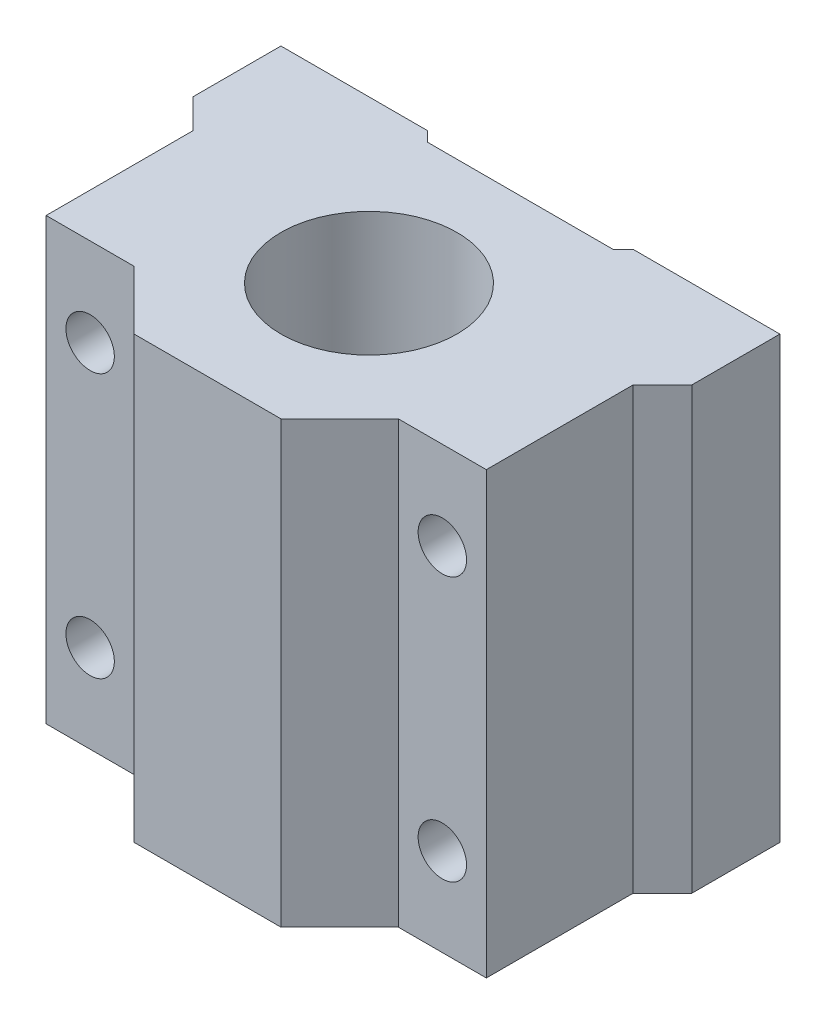
ISO-10303-21;
HEADER;
FILE_DESCRIPTION(('STEP AP214'),'2;1');
FILE_NAME('part.step','',(''),(''),'','','');
FILE_SCHEMA(('AUTOMOTIVE_DESIGN { 1 0 10303 214 1 1 1 1 }'));
ENDSEC;
DATA;
#1=APPLICATION_CONTEXT('core data for automotive mechanical design processes');
#2=APPLICATION_PROTOCOL_DEFINITION('international standard','automotive_design',2000,#1);
#3=PRODUCT_CONTEXT('',#1,'mechanical');
#4=PRODUCT('Part','Part','',(#3));
#5=PRODUCT_RELATED_PRODUCT_CATEGORY('part','',(#4));
#6=PRODUCT_DEFINITION_FORMATION('','',#4);
#7=PRODUCT_DEFINITION_CONTEXT('part definition',#1,'design');
#8=PRODUCT_DEFINITION('design','',#6,#7);
#9=PRODUCT_DEFINITION_SHAPE('','',#8);
#10=(LENGTH_UNIT() NAMED_UNIT(*) SI_UNIT(.MILLI.,.METRE.));
#11=(NAMED_UNIT(*) PLANE_ANGLE_UNIT() SI_UNIT($,.RADIAN.));
#12=(NAMED_UNIT(*) SI_UNIT($,.STERADIAN.) SOLID_ANGLE_UNIT());
#13=UNCERTAINTY_MEASURE_WITH_UNIT(LENGTH_MEASURE(1.E-05),#10,'distance_accuracy_value','');
#14=(GEOMETRIC_REPRESENTATION_CONTEXT(3) GLOBAL_UNCERTAINTY_ASSIGNED_CONTEXT((#13)) GLOBAL_UNIT_ASSIGNED_CONTEXT((#10,
#11,#12)) REPRESENTATION_CONTEXT('',''));
#15=CARTESIAN_POINT('',(0.,0.,0.));
#16=DIRECTION('',(0.,0.,1.));
#17=DIRECTION('',(1.,0.,0.));
#18=AXIS2_PLACEMENT_3D('',#15,#16,#17);
#19=CARTESIAN_POINT('',(0.,30.,-11.));
#20=DIRECTION('',(0.,0.,1.));
#21=DIRECTION('',(1.,0.,0.));
#22=AXIS2_PLACEMENT_3D('',#19,#20,#21);
#23=PLANE('',#22);
#24=CARTESIAN_POINT('',(-12.,6.,-11.));
#25=DIRECTION('',(0.,0.,-1.));
#26=DIRECTION('',(-1.,0.,0.));
#27=AXIS2_PLACEMENT_3D('',#24,#25,#26);
#28=CIRCLE('',#27,1.65);
#29=CARTESIAN_POINT('',(-13.65,6.,-11.));
#30=VERTEX_POINT('',#29);
#31=EDGE_CURVE('E232',#30,#30,#28,.T.);
#32=ORIENTED_EDGE('',*,*,#31,.F.);
#33=EDGE_LOOP('',(#32));
#34=FACE_BOUND('',#33,.T.);
#35=CARTESIAN_POINT('',(-12.,24.,-11.));
#36=DIRECTION('',(0.,0.,-1.));
#37=DIRECTION('',(1.,0.,0.));
#38=AXIS2_PLACEMENT_3D('',#35,#36,#37);
#39=CIRCLE('',#38,1.65);
#40=CARTESIAN_POINT('',(-10.35,24.,-11.));
#41=VERTEX_POINT('',#40);
#42=EDGE_CURVE('E321',#41,#41,#39,.T.);
#43=ORIENTED_EDGE('',*,*,#42,.F.);
#44=EDGE_LOOP('',(#43));
#45=FACE_BOUND('',#44,.T.);
#46=DIRECTION('',(-1.,0.,0.));
#47=VECTOR('',#46,1.);
#48=CARTESIAN_POINT('',(0.,30.,-11.));
#49=LINE('',#48,#47);
#50=CARTESIAN_POINT('',(-7.,30.,-11.));
#51=VERTEX_POINT('',#50);
#52=CARTESIAN_POINT('',(-17.,30.,-11.));
#53=VERTEX_POINT('',#52);
#54=EDGE_CURVE('E330',#51,#53,#49,.T.);
#55=ORIENTED_EDGE('',*,*,#54,.F.);
#56=DIRECTION('',(0.,-1.,0.));
#57=VECTOR('',#56,1.);
#58=CARTESIAN_POINT('',(-7.,30.,-11.));
#59=LINE('',#58,#57);
#60=CARTESIAN_POINT('',(-7.,0.,-11.));
#61=VERTEX_POINT('',#60);
#62=EDGE_CURVE('E316',#51,#61,#59,.T.);
#63=ORIENTED_EDGE('',*,*,#62,.T.);
#64=DIRECTION('',(-1.,0.,0.));
#65=VECTOR('',#64,1.);
#66=CARTESIAN_POINT('',(0.,0.,-11.));
#67=LINE('',#66,#65);
#68=CARTESIAN_POINT('',(-17.,0.,-11.));
#69=VERTEX_POINT('',#68);
#70=EDGE_CURVE('E174',#61,#69,#67,.T.);
#71=ORIENTED_EDGE('',*,*,#70,.T.);
#72=DIRECTION('',(0.,-1.,0.));
#73=VECTOR('',#72,1.);
#74=CARTESIAN_POINT('',(-17.,30.,-11.));
#75=LINE('',#74,#73);
#76=EDGE_CURVE('E44',#53,#69,#75,.T.);
#77=ORIENTED_EDGE('',*,*,#76,.F.);
#78=EDGE_LOOP('',(#55,#63,#71,#77));
#79=FACE_BOUND('',#78,.T.);
#80=ADVANCED_FACE('F35',(#34,#45,#79),#23,.F.);
#81=CARTESIAN_POINT('',(17.,30.,0.));
#82=DIRECTION('',(1.,0.,0.));
#83=DIRECTION('',(0.,0.,-1.));
#84=AXIS2_PLACEMENT_3D('',#81,#82,#83);
#85=PLANE('',#84);
#86=DIRECTION('',(0.,0.,1.));
#87=VECTOR('',#86,1.);
#88=CARTESIAN_POINT('',(17.,0.,0.));
#89=LINE('',#88,#87);
#90=CARTESIAN_POINT('',(17.,0.,-11.));
#91=VERTEX_POINT('',#90);
#92=CARTESIAN_POINT('',(17.,0.,-4.99999999999999));
#93=VERTEX_POINT('',#92);
#94=EDGE_CURVE('E172',#91,#93,#89,.T.);
#95=ORIENTED_EDGE('',*,*,#94,.F.);
#96=DIRECTION('',(0.,-1.,0.));
#97=VECTOR('',#96,1.);
#98=CARTESIAN_POINT('',(17.,30.,-11.));
#99=LINE('',#98,#97);
#100=CARTESIAN_POINT('',(17.,30.,-11.));
#101=VERTEX_POINT('',#100);
#102=EDGE_CURVE('E11',#101,#91,#99,.T.);
#103=ORIENTED_EDGE('',*,*,#102,.F.);
#104=DIRECTION('',(0.,0.,1.));
#105=VECTOR('',#104,1.);
#106=CARTESIAN_POINT('',(17.,30.,0.));
#107=LINE('',#106,#105);
#108=CARTESIAN_POINT('',(17.,30.,-4.99999999999999));
#109=VERTEX_POINT('',#108);
#110=EDGE_CURVE('E328',#101,#109,#107,.T.);
#111=ORIENTED_EDGE('',*,*,#110,.T.);
#112=DIRECTION('',(0.,-1.,0.));
#113=VECTOR('',#112,1.);
#114=CARTESIAN_POINT('',(17.,30.,-4.99999999999999));
#115=LINE('',#114,#113);
#116=EDGE_CURVE('E61',#109,#93,#115,.T.);
#117=ORIENTED_EDGE('',*,*,#116,.T.);
#118=EDGE_LOOP('',(#95,#103,#111,#117));
#119=FACE_BOUND('',#118,.T.);
#120=ADVANCED_FACE('F262',(#119),#85,.T.);
#121=CARTESIAN_POINT('',(12.,6.,-11.));
#122=DIRECTION('',(0.,0.,-1.));
#123=DIRECTION('',(1.,0.,0.));
#124=AXIS2_PLACEMENT_3D('',#121,#122,#123);
#125=CIRCLE('',#124,1.65);
#126=CARTESIAN_POINT('',(13.65,6.,-11.));
#127=VERTEX_POINT('',#126);
#128=EDGE_CURVE('E283',#127,#127,#125,.T.);
#129=ORIENTED_EDGE('',*,*,#128,.F.);
#130=EDGE_LOOP('',(#129));
#131=FACE_BOUND('',#130,.T.);
#132=CARTESIAN_POINT('',(12.,24.,-11.));
#133=DIRECTION('',(0.,0.,-1.));
#134=DIRECTION('',(-1.,0.,0.));
#135=AXIS2_PLACEMENT_3D('',#132,#133,#134);
#136=CIRCLE('',#135,1.65);
#137=CARTESIAN_POINT('',(10.35,24.,-11.));
#138=VERTEX_POINT('',#137);
#139=EDGE_CURVE('E287',#138,#138,#136,.T.);
#140=ORIENTED_EDGE('',*,*,#139,.F.);
#141=EDGE_LOOP('',(#140));
#142=FACE_BOUND('',#141,.T.);
#143=CARTESIAN_POINT('',(7.,0.,-11.));
#144=VERTEX_POINT('',#143);
#145=EDGE_CURVE('E175',#91,#144,#67,.T.);
#146=ORIENTED_EDGE('',*,*,#145,.T.);
#147=DIRECTION('',(0.,-1.,0.));
#148=VECTOR('',#147,1.);
#149=CARTESIAN_POINT('',(7.,30.,-11.));
#150=LINE('',#149,#148);
#151=CARTESIAN_POINT('',(7.,30.,-11.));
#152=VERTEX_POINT('',#151);
#153=EDGE_CURVE('E52',#152,#144,#150,.T.);
#154=ORIENTED_EDGE('',*,*,#153,.F.);
#155=EDGE_CURVE('E331',#101,#152,#49,.T.);
#156=ORIENTED_EDGE('',*,*,#155,.F.);
#157=ORIENTED_EDGE('',*,*,#102,.T.);
#158=EDGE_LOOP('',(#146,#154,#156,#157));
#159=FACE_BOUND('',#158,.T.);
#160=ADVANCED_FACE('F265',(#131,#142,#159),#23,.F.);
#161=CARTESIAN_POINT('',(-17.,30.,0.));
#162=DIRECTION('',(1.,0.,0.));
#163=DIRECTION('',(0.,0.,-1.));
#164=AXIS2_PLACEMENT_3D('',#161,#162,#163);
#165=PLANE('',#164);
#166=DIRECTION('',(0.,0.,1.));
#167=VECTOR('',#166,1.);
#168=CARTESIAN_POINT('',(-17.,0.,0.));
#169=LINE('',#168,#167);
#170=CARTESIAN_POINT('',(-17.,0.,-4.99999999999999));
#171=VERTEX_POINT('',#170);
#172=EDGE_CURVE('E178',#69,#171,#169,.T.);
#173=ORIENTED_EDGE('',*,*,#172,.T.);
#174=DIRECTION('',(0.,-1.,0.));
#175=VECTOR('',#174,1.);
#176=CARTESIAN_POINT('',(-17.,30.,-4.99999999999999));
#177=LINE('',#176,#175);
#178=CARTESIAN_POINT('',(-17.,30.,-4.99999999999999));
#179=VERTEX_POINT('',#178);
#180=EDGE_CURVE('E223',#179,#171,#177,.T.);
#181=ORIENTED_EDGE('',*,*,#180,.F.);
#182=DIRECTION('',(0.,0.,1.));
#183=VECTOR('',#182,1.);
#184=CARTESIAN_POINT('',(-17.,30.,0.));
#185=LINE('',#184,#183);
#186=EDGE_CURVE('E333',#53,#179,#185,.T.);
#187=ORIENTED_EDGE('',*,*,#186,.F.);
#188=ORIENTED_EDGE('',*,*,#76,.T.);
#189=EDGE_LOOP('',(#173,#181,#187,#188));
#190=FACE_BOUND('',#189,.T.);
#191=ADVANCED_FACE('F273',(#190),#165,.F.);
#192=CARTESIAN_POINT('',(-6.00000000000006,30.,6.00000000000001));
#193=DIRECTION('',(0.707106781186551,0.,-0.707106781186544));
#194=DIRECTION('',(-0.707106781186544,0.,-0.707106781186551));
#195=AXIS2_PLACEMENT_3D('',#192,#193,#194);
#196=PLANE('',#195);
#197=DIRECTION('',(0.707106781186544,0.,0.707106781186551));
#198=VECTOR('',#197,1.);
#199=CARTESIAN_POINT('',(-6.00000000000006,0.,6.00000000000001));
#200=LINE('',#199,#198);
#201=CARTESIAN_POINT('',(-14.9988878092421,0.,-2.99888780924207));
#202=VERTEX_POINT('',#201);
#203=EDGE_CURVE('E181',#171,#202,#200,.T.);
#204=ORIENTED_EDGE('',*,*,#203,.T.);
#205=DIRECTION('',(0.,-1.,0.));
#206=VECTOR('',#205,1.);
#207=CARTESIAN_POINT('',(-14.9988878092421,30.,-2.99888780924207));
#208=LINE('',#207,#206);
#209=CARTESIAN_POINT('',(-14.9988878092421,30.,-2.99888780924207));
#210=VERTEX_POINT('',#209);
#211=EDGE_CURVE('E220',#210,#202,#208,.T.);
#212=ORIENTED_EDGE('',*,*,#211,.F.);
#213=DIRECTION('',(0.707106781186544,0.,0.707106781186551));
#214=VECTOR('',#213,1.);
#215=CARTESIAN_POINT('',(-6.00000000000006,30.,6.00000000000001));
#216=LINE('',#215,#214);
#217=EDGE_CURVE('E336',#179,#210,#216,.T.);
#218=ORIENTED_EDGE('',*,*,#217,.F.);
#219=ORIENTED_EDGE('',*,*,#180,.T.);
#220=EDGE_LOOP('',(#204,#212,#218,#219));
#221=FACE_BOUND('',#220,.T.);
#222=ADVANCED_FACE('F278',(#221),#196,.F.);
#223=CARTESIAN_POINT('',(-14.9988878092421,30.,0.));
#224=DIRECTION('',(1.,0.,0.));
#225=DIRECTION('',(0.,0.,-1.));
#226=AXIS2_PLACEMENT_3D('',#223,#224,#225);
#227=PLANE('',#226);
#228=DIRECTION('',(0.,0.,1.));
#229=VECTOR('',#228,1.);
#230=CARTESIAN_POINT('',(-14.9988878092421,0.,0.));
#231=LINE('',#230,#229);
#232=CARTESIAN_POINT('',(-14.9988878092421,0.,7.00111219075793));
#233=VERTEX_POINT('',#232);
#234=EDGE_CURVE('E184',#202,#233,#231,.T.);
#235=ORIENTED_EDGE('',*,*,#234,.T.);
#236=DIRECTION('',(0.,-1.,0.));
#237=VECTOR('',#236,1.);
#238=CARTESIAN_POINT('',(-14.9988878092421,30.,7.00111219075793));
#239=LINE('',#238,#237);
#240=CARTESIAN_POINT('',(-14.9988878092421,30.,7.00111219075793));
#241=VERTEX_POINT('',#240);
#242=EDGE_CURVE('E217',#241,#233,#239,.T.);
#243=ORIENTED_EDGE('',*,*,#242,.F.);
#244=DIRECTION('',(0.,0.,1.));
#245=VECTOR('',#244,1.);
#246=CARTESIAN_POINT('',(-14.9988878092421,30.,0.));
#247=LINE('',#246,#245);
#248=EDGE_CURVE('E339',#210,#241,#247,.T.);
#249=ORIENTED_EDGE('',*,*,#248,.F.);
#250=ORIENTED_EDGE('',*,*,#211,.T.);
#251=EDGE_LOOP('',(#235,#243,#249,#250));
#252=FACE_BOUND('',#251,.T.);
#253=ADVANCED_FACE('F384',(#252),#227,.F.);
#254=CARTESIAN_POINT('',(0.,30.,7.00111219075794));
#255=DIRECTION('',(0.,0.,-1.));
#256=DIRECTION('',(-1.,0.,0.));
#257=AXIS2_PLACEMENT_3D('',#254,#255,#256);
#258=PLANE('',#257);
#259=CARTESIAN_POINT('',(-12.,24.,7.00111219075793));
#260=DIRECTION('',(0.,0.,-1.));
#261=DIRECTION('',(-1.,0.,0.));
#262=AXIS2_PLACEMENT_3D('',#259,#260,#261);
#263=CIRCLE('',#262,1.65);
#264=CARTESIAN_POINT('',(-13.65,24.,7.00111219075793));
#265=VERTEX_POINT('',#264);
#266=EDGE_CURVE('E39',#265,#265,#263,.T.);
#267=ORIENTED_EDGE('',*,*,#266,.T.);
#268=EDGE_LOOP('',(#267));
#269=FACE_BOUND('',#268,.T.);
#270=CARTESIAN_POINT('',(-12.,6.,7.00111219075793));
#271=DIRECTION('',(0.,0.,-1.));
#272=DIRECTION('',(-1.,0.,0.));
#273=AXIS2_PLACEMENT_3D('',#270,#271,#272);
#274=CIRCLE('',#273,1.65);
#275=CARTESIAN_POINT('',(-13.65,6.,7.00111219075793));
#276=VERTEX_POINT('',#275);
#277=EDGE_CURVE('E234',#276,#276,#274,.T.);
#278=ORIENTED_EDGE('',*,*,#277,.T.);
#279=EDGE_LOOP('',(#278));
#280=FACE_BOUND('',#279,.T.);
#281=DIRECTION('',(1.,0.,0.));
#282=VECTOR('',#281,1.);
#283=CARTESIAN_POINT('',(0.,0.,7.00111219075794));
#284=LINE('',#283,#282);
#285=CARTESIAN_POINT('',(-8.99888780924206,0.,7.00111219075793));
#286=VERTEX_POINT('',#285);
#287=EDGE_CURVE('E187',#233,#286,#284,.T.);
#288=ORIENTED_EDGE('',*,*,#287,.T.);
#289=DIRECTION('',(0.,-1.,0.));
#290=VECTOR('',#289,1.);
#291=CARTESIAN_POINT('',(-8.99888780924206,30.,7.00111219075793));
#292=LINE('',#291,#290);
#293=CARTESIAN_POINT('',(-8.99888780924206,30.,7.00111219075793));
#294=VERTEX_POINT('',#293);
#295=EDGE_CURVE('E214',#294,#286,#292,.T.);
#296=ORIENTED_EDGE('',*,*,#295,.F.);
#297=DIRECTION('',(1.,0.,0.));
#298=VECTOR('',#297,1.);
#299=CARTESIAN_POINT('',(0.,30.,7.00111219075794));
#300=LINE('',#299,#298);
#301=EDGE_CURVE('E342',#241,#294,#300,.T.);
#302=ORIENTED_EDGE('',*,*,#301,.F.);
#303=ORIENTED_EDGE('',*,*,#242,.T.);
#304=EDGE_LOOP('',(#288,#296,#302,#303));
#305=FACE_BOUND('',#304,.T.);
#306=ADVANCED_FACE('F241',(#269,#280,#305),#258,.F.);
#307=CARTESIAN_POINT('',(-7.99999999999999,30.,8.00000000000001));
#308=DIRECTION('',(0.707106781186547,0.,-0.707106781186549));
#309=DIRECTION('',(-0.707106781186549,0.,-0.707106781186547));
#310=AXIS2_PLACEMENT_3D('',#307,#308,#309);
#311=PLANE('',#310);
#312=DIRECTION('',(0.707106781186548,0.,0.707106781186547));
#313=VECTOR('',#312,1.);
#314=CARTESIAN_POINT('',(-7.99999999999999,0.,8.00000000000001));
#315=LINE('',#314,#313);
#316=CARTESIAN_POINT('',(-4.99999999999999,0.,11.));
#317=VERTEX_POINT('',#316);
#318=EDGE_CURVE('E190',#286,#317,#315,.T.);
#319=ORIENTED_EDGE('',*,*,#318,.T.);
#320=DIRECTION('',(0.,-1.,0.));
#321=VECTOR('',#320,1.);
#322=CARTESIAN_POINT('',(-4.99999999999999,30.,11.));
#323=LINE('',#322,#321);
#324=CARTESIAN_POINT('',(-4.99999999999999,30.,11.));
#325=VERTEX_POINT('',#324);
#326=EDGE_CURVE('E211',#325,#317,#323,.T.);
#327=ORIENTED_EDGE('',*,*,#326,.F.);
#328=DIRECTION('',(0.707106781186548,0.,0.707106781186547));
#329=VECTOR('',#328,1.);
#330=CARTESIAN_POINT('',(-7.99999999999999,30.,8.00000000000001));
#331=LINE('',#330,#329);
#332=EDGE_CURVE('E345',#294,#325,#331,.T.);
#333=ORIENTED_EDGE('',*,*,#332,.F.);
#334=ORIENTED_EDGE('',*,*,#295,.T.);
#335=EDGE_LOOP('',(#319,#327,#333,#334));
#336=FACE_BOUND('',#335,.T.);
#337=ADVANCED_FACE('F387',(#336),#311,.F.);
#338=CARTESIAN_POINT('',(0.,30.,11.));
#339=DIRECTION('',(0.,0.,-1.));
#340=DIRECTION('',(-1.,0.,0.));
#341=AXIS2_PLACEMENT_3D('',#338,#339,#340);
#342=PLANE('',#341);
#343=DIRECTION('',(1.,0.,0.));
#344=VECTOR('',#343,1.);
#345=CARTESIAN_POINT('',(0.,0.,11.));
#346=LINE('',#345,#344);
#347=CARTESIAN_POINT('',(4.99999999999999,0.,11.));
#348=VERTEX_POINT('',#347);
#349=EDGE_CURVE('E193',#317,#348,#346,.T.);
#350=ORIENTED_EDGE('',*,*,#349,.T.);
#351=DIRECTION('',(0.,-1.,0.));
#352=VECTOR('',#351,1.);
#353=CARTESIAN_POINT('',(4.99999999999999,30.,11.));
#354=LINE('',#353,#352);
#355=CARTESIAN_POINT('',(4.99999999999999,30.,11.));
#356=VERTEX_POINT('',#355);
#357=EDGE_CURVE('E209',#356,#348,#354,.T.);
#358=ORIENTED_EDGE('',*,*,#357,.F.);
#359=DIRECTION('',(1.,0.,0.));
#360=VECTOR('',#359,1.);
#361=CARTESIAN_POINT('',(0.,30.,11.));
#362=LINE('',#361,#360);
#363=EDGE_CURVE('E348',#325,#356,#362,.T.);
#364=ORIENTED_EDGE('',*,*,#363,.F.);
#365=ORIENTED_EDGE('',*,*,#326,.T.);
#366=EDGE_LOOP('',(#350,#358,#364,#365));
#367=FACE_BOUND('',#366,.T.);
#368=ADVANCED_FACE('F390',(#367),#342,.F.);
#369=CARTESIAN_POINT('',(7.99999999999999,30.,8.00000000000001));
#370=DIRECTION('',(0.707106781186547,0.,0.707106781186549));
#371=DIRECTION('',(0.707106781186549,0.,-0.707106781186547));
#372=AXIS2_PLACEMENT_3D('',#369,#370,#371);
#373=PLANE('',#372);
#374=DIRECTION('',(-0.707106781186548,0.,0.707106781186547));
#375=VECTOR('',#374,1.);
#376=CARTESIAN_POINT('',(7.99999999999999,0.,8.00000000000001));
#377=LINE('',#376,#375);
#378=CARTESIAN_POINT('',(8.99888780924207,0.,7.00111219075793));
#379=VERTEX_POINT('',#378);
#380=EDGE_CURVE('E196',#379,#348,#377,.T.);
#381=ORIENTED_EDGE('',*,*,#380,.F.);
#382=DIRECTION('',(0.,-1.,0.));
#383=VECTOR('',#382,1.);
#384=CARTESIAN_POINT('',(8.99888780924207,30.,7.00111219075793));
#385=LINE('',#384,#383);
#386=CARTESIAN_POINT('',(8.99888780924207,30.,7.00111219075793));
#387=VERTEX_POINT('',#386);
#388=EDGE_CURVE('E149',#387,#379,#385,.T.);
#389=ORIENTED_EDGE('',*,*,#388,.F.);
#390=DIRECTION('',(-0.707106781186548,0.,0.707106781186547));
#391=VECTOR('',#390,1.);
#392=CARTESIAN_POINT('',(7.99999999999999,30.,8.00000000000001));
#393=LINE('',#392,#391);
#394=EDGE_CURVE('E161',#387,#356,#393,.T.);
#395=ORIENTED_EDGE('',*,*,#394,.T.);
#396=ORIENTED_EDGE('',*,*,#357,.T.);
#397=EDGE_LOOP('',(#381,#389,#395,#396));
#398=FACE_BOUND('',#397,.T.);
#399=ADVANCED_FACE('F351',(#398),#373,.T.);
#400=CARTESIAN_POINT('',(0.,30.,7.00111219075794));
#401=DIRECTION('',(0.,0.,1.));
#402=DIRECTION('',(1.,0.,0.));
#403=AXIS2_PLACEMENT_3D('',#400,#401,#402);
#404=PLANE('',#403);
#405=CARTESIAN_POINT('',(12.,6.,7.00111219075793));
#406=DIRECTION('',(0.,0.,1.));
#407=DIRECTION('',(1.,0.,0.));
#408=AXIS2_PLACEMENT_3D('',#405,#406,#407);
#409=CIRCLE('',#408,1.65);
#410=CARTESIAN_POINT('',(13.65,6.,7.00111219075793));
#411=VERTEX_POINT('',#410);
#412=EDGE_CURVE('E231',#411,#411,#409,.T.);
#413=ORIENTED_EDGE('',*,*,#412,.F.);
#414=EDGE_LOOP('',(#413));
#415=FACE_BOUND('',#414,.T.);
#416=CARTESIAN_POINT('',(12.,24.,7.00111219075793));
#417=DIRECTION('',(0.,0.,1.));
#418=DIRECTION('',(1.,0.,0.));
#419=AXIS2_PLACEMENT_3D('',#416,#417,#418);
#420=CIRCLE('',#419,1.65);
#421=CARTESIAN_POINT('',(13.65,24.,7.00111219075793));
#422=VERTEX_POINT('',#421);
#423=EDGE_CURVE('E228',#422,#422,#420,.T.);
#424=ORIENTED_EDGE('',*,*,#423,.F.);
#425=EDGE_LOOP('',(#424));
#426=FACE_BOUND('',#425,.T.);
#427=DIRECTION('',(-1.,0.,0.));
#428=VECTOR('',#427,1.);
#429=CARTESIAN_POINT('',(0.,0.,7.00111219075794));
#430=LINE('',#429,#428);
#431=CARTESIAN_POINT('',(14.9988878092421,0.,7.00111219075793));
#432=VERTEX_POINT('',#431);
#433=EDGE_CURVE('E144',#432,#379,#430,.T.);
#434=ORIENTED_EDGE('',*,*,#433,.F.);
#435=DIRECTION('',(0.,-1.,0.));
#436=VECTOR('',#435,1.);
#437=CARTESIAN_POINT('',(14.9988878092421,30.,7.00111219075793));
#438=LINE('',#437,#436);
#439=CARTESIAN_POINT('',(14.9988878092421,30.,7.00111219075793));
#440=VERTEX_POINT('',#439);
#441=EDGE_CURVE('E139',#440,#432,#438,.T.);
#442=ORIENTED_EDGE('',*,*,#441,.F.);
#443=DIRECTION('',(-1.,0.,0.));
#444=VECTOR('',#443,1.);
#445=CARTESIAN_POINT('',(0.,30.,7.00111219075794));
#446=LINE('',#445,#444);
#447=EDGE_CURVE('E142',#440,#387,#446,.T.);
#448=ORIENTED_EDGE('',*,*,#447,.T.);
#449=ORIENTED_EDGE('',*,*,#388,.T.);
#450=EDGE_LOOP('',(#434,#442,#448,#449));
#451=FACE_BOUND('',#450,.T.);
#452=ADVANCED_FACE('F141',(#415,#426,#451),#404,.T.);
#453=CARTESIAN_POINT('',(14.9988878092421,30.,0.));
#454=DIRECTION('',(1.,0.,0.));
#455=DIRECTION('',(0.,0.,-1.));
#456=AXIS2_PLACEMENT_3D('',#453,#454,#455);
#457=PLANE('',#456);
#458=DIRECTION('',(0.,0.,1.));
#459=VECTOR('',#458,1.);
#460=CARTESIAN_POINT('',(14.9988878092421,0.,0.));
#461=LINE('',#460,#459);
#462=CARTESIAN_POINT('',(14.9988878092421,0.,-2.99888780924207));
#463=VERTEX_POINT('',#462);
#464=EDGE_CURVE('E200',#463,#432,#461,.T.);
#465=ORIENTED_EDGE('',*,*,#464,.F.);
#466=DIRECTION('',(0.,-1.,0.));
#467=VECTOR('',#466,1.);
#468=CARTESIAN_POINT('',(14.9988878092421,30.,-2.99888780924207));
#469=LINE('',#468,#467);
#470=CARTESIAN_POINT('',(14.9988878092421,30.,-2.99888780924207));
#471=VERTEX_POINT('',#470);
#472=EDGE_CURVE('E150',#471,#463,#469,.T.);
#473=ORIENTED_EDGE('',*,*,#472,.F.);
#474=DIRECTION('',(0.,0.,1.));
#475=VECTOR('',#474,1.);
#476=CARTESIAN_POINT('',(14.9988878092421,30.,0.));
#477=LINE('',#476,#475);
#478=EDGE_CURVE('E159',#471,#440,#477,.T.);
#479=ORIENTED_EDGE('',*,*,#478,.T.);
#480=ORIENTED_EDGE('',*,*,#441,.T.);
#481=EDGE_LOOP('',(#465,#473,#479,#480));
#482=FACE_BOUND('',#481,.T.);
#483=ADVANCED_FACE('F163',(#482),#457,.T.);
#484=CARTESIAN_POINT('',(0.,30.,0.));
#485=DIRECTION('',(0.,-1.,0.));
#486=DIRECTION('',(0.,0.,-1.));
#487=AXIS2_PLACEMENT_3D('',#484,#485,#486);
#488=CYLINDRICAL_SURFACE('',#487,6.);
#489=CARTESIAN_POINT('',(0.,30.,0.));
#490=DIRECTION('',(0.,1.,0.));
#491=DIRECTION('',(0.,0.,1.));
#492=AXIS2_PLACEMENT_3D('',#489,#490,#491);
#493=CIRCLE('',#492,6.);
#494=CARTESIAN_POINT('',(0.,30.,6.));
#495=VERTEX_POINT('',#494);
#496=EDGE_CURVE('E205',#495,#495,#493,.T.);
#497=ORIENTED_EDGE('',*,*,#496,.T.);
#498=EDGE_LOOP('',(#497));
#499=FACE_BOUND('',#498,.T.);
#500=CARTESIAN_POINT('',(0.,0.,0.));
#501=DIRECTION('',(0.,1.,0.));
#502=DIRECTION('',(0.,0.,1.));
#503=AXIS2_PLACEMENT_3D('',#500,#501,#502);
#504=CIRCLE('',#503,6.);
#505=CARTESIAN_POINT('',(0.,0.,6.));
#506=VERTEX_POINT('',#505);
#507=EDGE_CURVE('E169',#506,#506,#504,.T.);
#508=ORIENTED_EDGE('',*,*,#507,.F.);
#509=EDGE_LOOP('',(#508));
#510=FACE_BOUND('',#509,.T.);
#511=ADVANCED_FACE('F37',(#499,#510),#488,.F.);
#512=CARTESIAN_POINT('',(6.00000000000005,30.,6.00000000000001));
#513=DIRECTION('',(0.70710678118655,0.,0.707106781186545));
#514=DIRECTION('',(0.707106781186545,0.,-0.70710678118655));
#515=AXIS2_PLACEMENT_3D('',#512,#513,#514);
#516=PLANE('',#515);
#517=DIRECTION('',(-0.707106781186545,0.,0.70710678118655));
#518=VECTOR('',#517,1.);
#519=CARTESIAN_POINT('',(6.00000000000005,0.,6.00000000000001));
#520=LINE('',#519,#518);
#521=EDGE_CURVE('E202',#93,#463,#520,.T.);
#522=ORIENTED_EDGE('',*,*,#521,.F.);
#523=ORIENTED_EDGE('',*,*,#116,.F.);
#524=DIRECTION('',(-0.707106781186545,0.,0.70710678118655));
#525=VECTOR('',#524,1.);
#526=CARTESIAN_POINT('',(6.00000000000005,30.,6.00000000000001));
#527=LINE('',#526,#525);
#528=EDGE_CURVE('E164',#109,#471,#527,.T.);
#529=ORIENTED_EDGE('',*,*,#528,.T.);
#530=ORIENTED_EDGE('',*,*,#472,.T.);
#531=EDGE_LOOP('',(#522,#523,#529,#530));
#532=FACE_BOUND('',#531,.T.);
#533=ADVANCED_FACE('F353',(#532),#516,.T.);
#534=CARTESIAN_POINT('',(0.,30.,0.));
#535=DIRECTION('',(0.,1.,0.));
#536=DIRECTION('',(0.,0.,1.));
#537=AXIS2_PLACEMENT_3D('',#534,#535,#536);
#538=PLANE('',#537);
#539=DIRECTION('',(-0.707106781186546,0.,-0.707106781186549));
#540=VECTOR('',#539,1.);
#541=CARTESIAN_POINT('',(-7.,30.,-11.));
#542=LINE('',#541,#540);
#543=CARTESIAN_POINT('',(-6.315883029906,30.,-10.315883029906));
#544=VERTEX_POINT('',#543);
#545=EDGE_CURVE('E303',#544,#51,#542,.T.);
#546=ORIENTED_EDGE('',*,*,#545,.T.);
#547=ORIENTED_EDGE('',*,*,#54,.T.);
#548=ORIENTED_EDGE('',*,*,#186,.T.);
#549=ORIENTED_EDGE('',*,*,#217,.T.);
#550=ORIENTED_EDGE('',*,*,#248,.T.);
#551=ORIENTED_EDGE('',*,*,#301,.T.);
#552=ORIENTED_EDGE('',*,*,#332,.T.);
#553=ORIENTED_EDGE('',*,*,#363,.T.);
#554=ORIENTED_EDGE('',*,*,#394,.F.);
#555=ORIENTED_EDGE('',*,*,#447,.F.);
#556=ORIENTED_EDGE('',*,*,#478,.F.);
#557=ORIENTED_EDGE('',*,*,#528,.F.);
#558=ORIENTED_EDGE('',*,*,#110,.F.);
#559=ORIENTED_EDGE('',*,*,#155,.T.);
#560=DIRECTION('',(-0.707106781186551,0.,0.707106781186544));
#561=VECTOR('',#560,1.);
#562=CARTESIAN_POINT('',(7.,30.,-11.));
#563=LINE('',#562,#561);
#564=CARTESIAN_POINT('',(6.31588302990599,30.,-10.315883029906));
#565=VERTEX_POINT('',#564);
#566=EDGE_CURVE('E358',#152,#565,#563,.T.);
#567=ORIENTED_EDGE('',*,*,#566,.T.);
#568=DIRECTION('',(-1.,0.,0.));
#569=VECTOR('',#568,1.);
#570=CARTESIAN_POINT('',(-6.315883029906,30.,-10.315883029906));
#571=LINE('',#570,#569);
#572=EDGE_CURVE('E319',#565,#544,#571,.T.);
#573=ORIENTED_EDGE('',*,*,#572,.T.);
#574=EDGE_LOOP('',(#546,#547,#548,#549,#550,#551,#552,#553,#554,#555,#556,#557,#558,#559,#567,#573));
#575=FACE_BOUND('',#574,.T.);
#576=ORIENTED_EDGE('',*,*,#496,.F.);
#577=EDGE_LOOP('',(#576));
#578=FACE_BOUND('',#577,.T.);
#579=ADVANCED_FACE('F156',(#575,#578),#538,.T.);
#580=CARTESIAN_POINT('',(0.,0.,0.));
#581=DIRECTION('',(0.,1.,0.));
#582=DIRECTION('',(0.,0.,1.));
#583=AXIS2_PLACEMENT_3D('',#580,#581,#582);
#584=PLANE('',#583);
#585=ORIENTED_EDGE('',*,*,#507,.T.);
#586=EDGE_LOOP('',(#585));
#587=FACE_BOUND('',#586,.T.);
#588=ORIENTED_EDGE('',*,*,#70,.F.);
#589=DIRECTION('',(-0.707106781186546,0.,-0.707106781186549));
#590=VECTOR('',#589,1.);
#591=CARTESIAN_POINT('',(-7.,0.,-11.));
#592=LINE('',#591,#590);
#593=CARTESIAN_POINT('',(-6.315883029906,0.,-10.315883029906));
#594=VERTEX_POINT('',#593);
#595=EDGE_CURVE('E301',#594,#61,#592,.T.);
#596=ORIENTED_EDGE('',*,*,#595,.F.);
#597=DIRECTION('',(-1.,0.,0.));
#598=VECTOR('',#597,1.);
#599=CARTESIAN_POINT('',(-6.315883029906,0.,-10.315883029906));
#600=LINE('',#599,#598);
#601=CARTESIAN_POINT('',(6.31588302990599,0.,-10.315883029906));
#602=VERTEX_POINT('',#601);
#603=EDGE_CURVE('E299',#602,#594,#600,.T.);
#604=ORIENTED_EDGE('',*,*,#603,.F.);
#605=DIRECTION('',(-0.707106781186551,0.,0.707106781186544));
#606=VECTOR('',#605,1.);
#607=CARTESIAN_POINT('',(7.,0.,-11.));
#608=LINE('',#607,#606);
#609=EDGE_CURVE('E295',#144,#602,#608,.T.);
#610=ORIENTED_EDGE('',*,*,#609,.F.);
#611=ORIENTED_EDGE('',*,*,#145,.F.);
#612=ORIENTED_EDGE('',*,*,#94,.T.);
#613=ORIENTED_EDGE('',*,*,#521,.T.);
#614=ORIENTED_EDGE('',*,*,#464,.T.);
#615=ORIENTED_EDGE('',*,*,#433,.T.);
#616=ORIENTED_EDGE('',*,*,#380,.T.);
#617=ORIENTED_EDGE('',*,*,#349,.F.);
#618=ORIENTED_EDGE('',*,*,#318,.F.);
#619=ORIENTED_EDGE('',*,*,#287,.F.);
#620=ORIENTED_EDGE('',*,*,#234,.F.);
#621=ORIENTED_EDGE('',*,*,#203,.F.);
#622=ORIENTED_EDGE('',*,*,#172,.F.);
#623=EDGE_LOOP('',(#588,#596,#604,#610,#611,#612,#613,#614,#615,#616,#617,#618,#619,#620,#621,#622));
#624=FACE_BOUND('',#623,.T.);
#625=ADVANCED_FACE('F293',(#587,#624),#584,.F.);
#626=CARTESIAN_POINT('',(12.,24.,11.));
#627=DIRECTION('',(0.,0.,-1.));
#628=DIRECTION('',(-1.,0.,0.));
#629=AXIS2_PLACEMENT_3D('',#626,#627,#628);
#630=CYLINDRICAL_SURFACE('',#629,1.65);
#631=ORIENTED_EDGE('',*,*,#423,.T.);
#632=EDGE_LOOP('',(#631));
#633=FACE_BOUND('',#632,.T.);
#634=ORIENTED_EDGE('',*,*,#139,.T.);
#635=EDGE_LOOP('',(#634));
#636=FACE_BOUND('',#635,.T.);
#637=ADVANCED_FACE('F473',(#633,#636),#630,.F.);
#638=CARTESIAN_POINT('',(12.,6.,11.));
#639=DIRECTION('',(0.,0.,-1.));
#640=DIRECTION('',(-1.,0.,0.));
#641=AXIS2_PLACEMENT_3D('',#638,#639,#640);
#642=CYLINDRICAL_SURFACE('',#641,1.65);
#643=ORIENTED_EDGE('',*,*,#412,.T.);
#644=EDGE_LOOP('',(#643));
#645=FACE_BOUND('',#644,.T.);
#646=ORIENTED_EDGE('',*,*,#128,.T.);
#647=EDGE_LOOP('',(#646));
#648=FACE_BOUND('',#647,.T.);
#649=ADVANCED_FACE('F256',(#645,#648),#642,.F.);
#650=CARTESIAN_POINT('',(-12.,6.,11.));
#651=DIRECTION('',(0.,0.,-1.));
#652=DIRECTION('',(-1.,0.,0.));
#653=AXIS2_PLACEMENT_3D('',#650,#651,#652);
#654=CYLINDRICAL_SURFACE('',#653,1.65);
#655=ORIENTED_EDGE('',*,*,#31,.T.);
#656=EDGE_LOOP('',(#655));
#657=FACE_BOUND('',#656,.T.);
#658=ORIENTED_EDGE('',*,*,#277,.F.);
#659=EDGE_LOOP('',(#658));
#660=FACE_BOUND('',#659,.T.);
#661=ADVANCED_FACE('F246',(#657,#660),#654,.F.);
#662=CARTESIAN_POINT('',(-12.,24.,11.));
#663=DIRECTION('',(0.,0.,-1.));
#664=DIRECTION('',(-1.,0.,0.));
#665=AXIS2_PLACEMENT_3D('',#662,#663,#664);
#666=CYLINDRICAL_SURFACE('',#665,1.65);
#667=ORIENTED_EDGE('',*,*,#42,.T.);
#668=EDGE_LOOP('',(#667));
#669=FACE_BOUND('',#668,.T.);
#670=ORIENTED_EDGE('',*,*,#266,.F.);
#671=EDGE_LOOP('',(#670));
#672=FACE_BOUND('',#671,.T.);
#673=ADVANCED_FACE('F243',(#669,#672),#666,.F.);
#674=CARTESIAN_POINT('',(-7.,30.,-11.));
#675=DIRECTION('',(-0.707106781186549,0.,0.707106781186546));
#676=DIRECTION('',(0.707106781186546,0.,0.707106781186549));
#677=AXIS2_PLACEMENT_3D('',#674,#675,#676);
#678=PLANE('',#677);
#679=ORIENTED_EDGE('',*,*,#595,.T.);
#680=ORIENTED_EDGE('',*,*,#62,.F.);
#681=ORIENTED_EDGE('',*,*,#545,.F.);
#682=DIRECTION('',(0.,-1.,0.));
#683=VECTOR('',#682,1.);
#684=CARTESIAN_POINT('',(-6.315883029906,30.,-10.315883029906));
#685=LINE('',#684,#683);
#686=EDGE_CURVE('E309',#544,#594,#685,.T.);
#687=ORIENTED_EDGE('',*,*,#686,.T.);
#688=EDGE_LOOP('',(#679,#680,#681,#687));
#689=FACE_BOUND('',#688,.T.);
#690=ADVANCED_FACE('F245',(#689),#678,.F.);
#691=CARTESIAN_POINT('',(-6.315883029906,30.,-10.315883029906));
#692=DIRECTION('',(0.,0.,1.));
#693=DIRECTION('',(1.,0.,0.));
#694=AXIS2_PLACEMENT_3D('',#691,#692,#693);
#695=PLANE('',#694);
#696=ORIENTED_EDGE('',*,*,#603,.T.);
#697=ORIENTED_EDGE('',*,*,#686,.F.);
#698=ORIENTED_EDGE('',*,*,#572,.F.);
#699=DIRECTION('',(0.,-1.,0.));
#700=VECTOR('',#699,1.);
#701=CARTESIAN_POINT('',(6.31588302990599,30.,-10.315883029906));
#702=LINE('',#701,#700);
#703=EDGE_CURVE('E312',#565,#602,#702,.T.);
#704=ORIENTED_EDGE('',*,*,#703,.T.);
#705=EDGE_LOOP('',(#696,#697,#698,#704));
#706=FACE_BOUND('',#705,.T.);
#707=ADVANCED_FACE('F253',(#706),#695,.F.);
#708=CARTESIAN_POINT('',(7.,30.,-11.));
#709=DIRECTION('',(0.707106781186544,0.,0.707106781186551));
#710=DIRECTION('',(0.707106781186551,0.,-0.707106781186544));
#711=AXIS2_PLACEMENT_3D('',#708,#709,#710);
#712=PLANE('',#711);
#713=ORIENTED_EDGE('',*,*,#609,.T.);
#714=ORIENTED_EDGE('',*,*,#703,.F.);
#715=ORIENTED_EDGE('',*,*,#566,.F.);
#716=ORIENTED_EDGE('',*,*,#153,.T.);
#717=EDGE_LOOP('',(#713,#714,#715,#716));
#718=FACE_BOUND('',#717,.T.);
#719=ADVANCED_FACE('F535',(#718),#712,.F.);
#720=CLOSED_SHELL('',(#80,#120,#160,#191,#222,#253,#306,#337,#368,#399,#452,#483,#511,#533,#579,
#625,#637,#649,#661,#673,#690,#707,#719));
#721=MANIFOLD_SOLID_BREP('B2',#720);
#722=ADVANCED_BREP_SHAPE_REPRESENTATION('',(#18,#721),#14);
#723=SHAPE_DEFINITION_REPRESENTATION(#9,#722);
ENDSEC;
END-ISO-10303-21;
